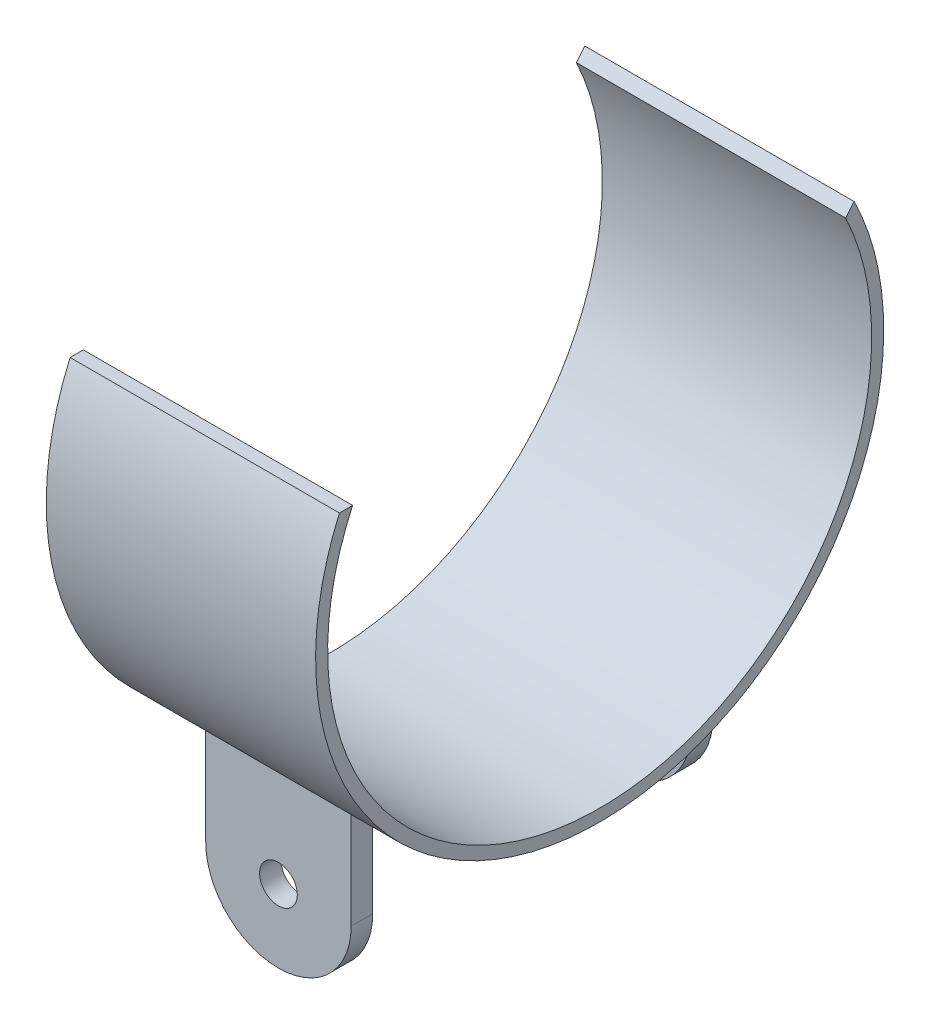
ISO-10303-21;
HEADER;
FILE_DESCRIPTION(('STEP AP214'),'2;1');
FILE_NAME('part.step','',(''),(''),'','','');
FILE_SCHEMA(('AUTOMOTIVE_DESIGN { 1 0 10303 214 1 1 1 1 }'));
ENDSEC;
DATA;
#1=APPLICATION_CONTEXT('core data for automotive mechanical design processes');
#2=APPLICATION_PROTOCOL_DEFINITION('international standard','automotive_design',2000,#1);
#3=PRODUCT_CONTEXT('',#1,'mechanical');
#4=PRODUCT('Part','Part','',(#3));
#5=PRODUCT_RELATED_PRODUCT_CATEGORY('part','',(#4));
#6=PRODUCT_DEFINITION_FORMATION('','',#4);
#7=PRODUCT_DEFINITION_CONTEXT('part definition',#1,'design');
#8=PRODUCT_DEFINITION('design','',#6,#7);
#9=PRODUCT_DEFINITION_SHAPE('','',#8);
#10=(LENGTH_UNIT() NAMED_UNIT(*) SI_UNIT(.MILLI.,.METRE.));
#11=(NAMED_UNIT(*) PLANE_ANGLE_UNIT() SI_UNIT($,.RADIAN.));
#12=(NAMED_UNIT(*) SI_UNIT($,.STERADIAN.) SOLID_ANGLE_UNIT());
#13=UNCERTAINTY_MEASURE_WITH_UNIT(LENGTH_MEASURE(1.E-05),#10,'distance_accuracy_value','');
#14=(GEOMETRIC_REPRESENTATION_CONTEXT(3) GLOBAL_UNCERTAINTY_ASSIGNED_CONTEXT((#13)) GLOBAL_UNIT_ASSIGNED_CONTEXT((#10,
#11,#12)) REPRESENTATION_CONTEXT('',''));
#15=CARTESIAN_POINT('',(0.,0.,0.));
#16=DIRECTION('',(0.,0.,1.));
#17=DIRECTION('',(1.,0.,0.));
#18=AXIS2_PLACEMENT_3D('',#15,#16,#17);
#19=CARTESIAN_POINT('',(0.,14.42923303716,-163.145841721306));
#20=DIRECTION('',(1.,0.,0.));
#21=DIRECTION('',(0.,0.,-1.));
#22=AXIS2_PLACEMENT_3D('',#19,#20,#21);
#23=CYLINDRICAL_SURFACE('',#22,263.670833432094);
#24=DIRECTION('',(1.,0.,0.));
#25=VECTOR('',#24,1.);
#26=CARTESIAN_POINT('',(0.,-200.206876614147,-10.));
#27=LINE('',#26,#25);
#28=CARTESIAN_POINT('',(-67.5,-200.206876614147,-10.));
#29=VERTEX_POINT('',#28);
#30=CARTESIAN_POINT('',(67.5,-200.206876614147,-10.));
#31=VERTEX_POINT('',#30);
#32=EDGE_CURVE('E169',#29,#31,#27,.T.);
#33=ORIENTED_EDGE('',*,*,#32,.F.);
#34=CARTESIAN_POINT('',(-67.5000000000001,14.42923303716,-163.145841721306));
#35=DIRECTION('',(1.,0.,0.));
#36=DIRECTION('',(0.,1.,0.));
#37=AXIS2_PLACEMENT_3D('',#34,#35,#36);
#38=CIRCLE('',#37,263.670833432094);
#39=CARTESIAN_POINT('',(-67.5,-184.424547156719,10.));
#40=VERTEX_POINT('',#39);
#41=EDGE_CURVE('E167',#40,#29,#38,.T.);
#42=ORIENTED_EDGE('',*,*,#41,.F.);
#43=DIRECTION('',(1.,0.,0.));
#44=VECTOR('',#43,1.);
#45=CARTESIAN_POINT('',(0.,-184.424547156719,10.));
#46=LINE('',#45,#44);
#47=CARTESIAN_POINT('',(67.5,-184.424547156719,10.));
#48=VERTEX_POINT('',#47);
#49=EDGE_CURVE('E161',#40,#48,#46,.T.);
#50=ORIENTED_EDGE('',*,*,#49,.T.);
#51=CARTESIAN_POINT('',(67.4999999999999,14.42923303716,-163.145841721306));
#52=DIRECTION('',(-1.,0.,0.));
#53=DIRECTION('',(0.,-1.,0.));
#54=AXIS2_PLACEMENT_3D('',#51,#52,#53);
#55=CIRCLE('',#54,263.670833432094);
#56=EDGE_CURVE('E164',#31,#48,#55,.T.);
#57=ORIENTED_EDGE('',*,*,#56,.F.);
#58=EDGE_LOOP('',(#33,#42,#50,#57));
#59=FACE_BOUND('',#58,.T.);
#60=CARTESIAN_POINT('',(125.,14.42923303716,-163.145841721306));
#61=DIRECTION('',(1.,0.,0.));
#62=DIRECTION('',(0.,0.400706305130195,0.916206558058229));
#63=AXIS2_PLACEMENT_3D('',#60,#61,#62);
#64=CIRCLE('',#63,263.670833432094);
#65=CARTESIAN_POINT('',(125.,120.083798472333,78.4311050378574));
#66=VERTEX_POINT('',#65);
#67=CARTESIAN_POINT('',(125.,131.574465119119,-399.364602625766));
#68=VERTEX_POINT('',#67);
#69=EDGE_CURVE('E156',#66,#68,#64,.T.);
#70=ORIENTED_EDGE('',*,*,#69,.F.);
#71=DIRECTION('',(1.,0.,0.));
#72=VECTOR('',#71,1.);
#73=CARTESIAN_POINT('',(125.,120.083798472333,78.4311050378574));
#74=LINE('',#73,#72);
#75=CARTESIAN_POINT('',(-125.,120.083798472333,78.4311050378574));
#76=VERTEX_POINT('',#75);
#77=EDGE_CURVE('E148',#76,#66,#74,.T.);
#78=ORIENTED_EDGE('',*,*,#77,.F.);
#79=CARTESIAN_POINT('',(-125.,14.42923303716,-163.145841721306));
#80=DIRECTION('',(1.,0.,0.));
#81=DIRECTION('',(0.,0.400706305130195,0.916206558058229));
#82=AXIS2_PLACEMENT_3D('',#79,#80,#81);
#83=CIRCLE('',#82,263.670833432094);
#84=CARTESIAN_POINT('',(-125.,131.574465119119,-399.364602625766));
#85=VERTEX_POINT('',#84);
#86=EDGE_CURVE('E143',#76,#85,#83,.T.);
#87=ORIENTED_EDGE('',*,*,#86,.T.);
#88=DIRECTION('',(1.,0.,0.));
#89=VECTOR('',#88,1.);
#90=CARTESIAN_POINT('',(125.,131.57446511912,-399.364602625766));
#91=LINE('',#90,#89);
#92=EDGE_CURVE('E141',#85,#68,#91,.T.);
#93=ORIENTED_EDGE('',*,*,#92,.T.);
#94=EDGE_LOOP('',(#70,#78,#87,#93));
#95=FACE_BOUND('',#94,.T.);
#96=CARTESIAN_POINT('',(-67.5000000000001,14.42923303716,-163.145841721306));
#97=DIRECTION('',(1.,0.,0.));
#98=DIRECTION('',(0.,1.,0.));
#99=AXIS2_PLACEMENT_3D('',#96,#97,#98);
#100=CIRCLE('',#99,263.670833432094);
#101=CARTESIAN_POINT('',(-67.5,-207.302298874776,-305.825329240573));
#102=VERTEX_POINT('',#101);
#103=CARTESIAN_POINT('',(-67.5,-193.074243423461,-325.825329240573));
#104=VERTEX_POINT('',#103);
#105=EDGE_CURVE('E45',#102,#104,#100,.T.);
#106=ORIENTED_EDGE('',*,*,#105,.F.);
#107=DIRECTION('',(1.,0.,0.));
#108=VECTOR('',#107,1.);
#109=CARTESIAN_POINT('',(0.,-207.302298874776,-305.825329240573));
#110=LINE('',#109,#108);
#111=CARTESIAN_POINT('',(67.5,-207.302298874776,-305.825329240573));
#112=VERTEX_POINT('',#111);
#113=EDGE_CURVE('E176',#112,#102,#110,.F.);
#114=ORIENTED_EDGE('',*,*,#113,.F.);
#115=CARTESIAN_POINT('',(67.4999999999999,14.42923303716,-163.145841721306));
#116=DIRECTION('',(-1.,0.,0.));
#117=DIRECTION('',(0.,-1.,0.));
#118=AXIS2_PLACEMENT_3D('',#115,#116,#117);
#119=CIRCLE('',#118,263.670833432094);
#120=CARTESIAN_POINT('',(67.5,-193.074243423461,-325.825329240573));
#121=VERTEX_POINT('',#120);
#122=EDGE_CURVE('E174',#121,#112,#119,.T.);
#123=ORIENTED_EDGE('',*,*,#122,.F.);
#124=DIRECTION('',(1.,0.,0.));
#125=VECTOR('',#124,1.);
#126=CARTESIAN_POINT('',(0.,-193.074243423461,-325.825329240573));
#127=LINE('',#126,#125);
#128=EDGE_CURVE('E171',#121,#104,#127,.F.);
#129=ORIENTED_EDGE('',*,*,#128,.T.);
#130=EDGE_LOOP('',(#106,#114,#123,#129));
#131=FACE_BOUND('',#130,.T.);
#132=ADVANCED_FACE('F37',(#59,#95,#131),#23,.T.);
#133=CARTESIAN_POINT('',(0.,120.083798472333,0.));
#134=DIRECTION('',(0.,1.,0.));
#135=DIRECTION('',(0.,0.,1.));
#136=AXIS2_PLACEMENT_3D('',#133,#134,#135);
#137=PLANE('',#136);
#138=DIRECTION('',(1.,0.,0.));
#139=VECTOR('',#138,1.);
#140=CARTESIAN_POINT('',(-125.,120.083798472333,66.1865868680776));
#141=LINE('',#140,#139);
#142=CARTESIAN_POINT('',(-125.,120.083798472333,66.1865868680776));
#143=VERTEX_POINT('',#142);
#144=CARTESIAN_POINT('',(125.,120.083798472333,66.1865868680776));
#145=VERTEX_POINT('',#144);
#146=EDGE_CURVE('E52',#143,#145,#141,.T.);
#147=ORIENTED_EDGE('',*,*,#146,.F.);
#148=DIRECTION('',(0.,0.,1.));
#149=VECTOR('',#148,1.);
#150=CARTESIAN_POINT('',(-125.,120.083798472333,78.4311050378574));
#151=LINE('',#150,#149);
#152=EDGE_CURVE('E138',#143,#76,#151,.T.);
#153=ORIENTED_EDGE('',*,*,#152,.T.);
#154=ORIENTED_EDGE('',*,*,#77,.T.);
#155=DIRECTION('',(0.,0.,-1.));
#156=VECTOR('',#155,1.);
#157=CARTESIAN_POINT('',(125.,120.083798472333,78.4311050378574));
#158=LINE('',#157,#156);
#159=EDGE_CURVE('E144',#66,#145,#158,.T.);
#160=ORIENTED_EDGE('',*,*,#159,.T.);
#161=EDGE_LOOP('',(#147,#153,#154,#160));
#162=FACE_BOUND('',#161,.T.);
#163=ADVANCED_FACE('F39',(#162),#137,.T.);
#164=CARTESIAN_POINT('',(0.,71.4927529371882,-348.950060093408));
#165=DIRECTION('',(0.,-0.642787609686544,-0.766044443118975));
#166=DIRECTION('',(0.,0.766044443118975,-0.642787609686544));
#167=AXIS2_PLACEMENT_3D('',#164,#165,#166);
#168=PLANE('',#167);
#169=DIRECTION('',(0.,0.766044443118975,-0.642787609686544));
#170=VECTOR('',#169,1.);
#171=CARTESIAN_POINT('',(-125.,131.57446511912,-399.364602625766));
#172=LINE('',#171,#170);
#173=CARTESIAN_POINT('',(-125.,122.19462001649,-391.49397805965));
#174=VERTEX_POINT('',#173);
#175=EDGE_CURVE('E136',#174,#85,#172,.T.);
#176=ORIENTED_EDGE('',*,*,#175,.F.);
#177=DIRECTION('',(1.,0.,0.));
#178=VECTOR('',#177,1.);
#179=CARTESIAN_POINT('',(-125.,122.19462001649,-391.49397805965));
#180=LINE('',#179,#178);
#181=CARTESIAN_POINT('',(125.,122.19462001649,-391.49397805965));
#182=VERTEX_POINT('',#181);
#183=EDGE_CURVE('E123',#174,#182,#180,.T.);
#184=ORIENTED_EDGE('',*,*,#183,.T.);
#185=DIRECTION('',(0.,-0.766044443118975,0.642787609686544));
#186=VECTOR('',#185,1.);
#187=CARTESIAN_POINT('',(125.,131.57446511912,-399.364602625766));
#188=LINE('',#187,#186);
#189=EDGE_CURVE('E158',#68,#182,#188,.T.);
#190=ORIENTED_EDGE('',*,*,#189,.F.);
#191=ORIENTED_EDGE('',*,*,#92,.F.);
#192=EDGE_LOOP('',(#176,#184,#190,#191));
#193=FACE_BOUND('',#192,.T.);
#194=ADVANCED_FACE('F140',(#193),#168,.F.);
#195=CARTESIAN_POINT('',(-125.,120.083798472333,78.4311050378574));
#196=DIRECTION('',(1.,0.,0.));
#197=DIRECTION('',(0.,0.,-1.));
#198=AXIS2_PLACEMENT_3D('',#195,#196,#197);
#199=PLANE('',#198);
#200=ORIENTED_EDGE('',*,*,#152,.F.);
#201=CARTESIAN_POINT('',(-125.,14.42923303716,-163.145841721306));
#202=DIRECTION('',(1.,0.,0.));
#203=DIRECTION('',(0.,0.,-1.));
#204=AXIS2_PLACEMENT_3D('',#201,#202,#203);
#205=CIRCLE('',#204,252.5);
#206=EDGE_CURVE('E126',#143,#174,#205,.T.);
#207=ORIENTED_EDGE('',*,*,#206,.T.);
#208=ORIENTED_EDGE('',*,*,#175,.T.);
#209=ORIENTED_EDGE('',*,*,#86,.F.);
#210=EDGE_LOOP('',(#200,#207,#208,#209));
#211=FACE_BOUND('',#210,.T.);
#212=ADVANCED_FACE('F134',(#211),#199,.F.);
#213=CARTESIAN_POINT('',(125.,120.083798472333,78.4311050378574));
#214=DIRECTION('',(-1.,0.,0.));
#215=DIRECTION('',(0.,0.,1.));
#216=AXIS2_PLACEMENT_3D('',#213,#214,#215);
#217=PLANE('',#216);
#218=ORIENTED_EDGE('',*,*,#189,.T.);
#219=CARTESIAN_POINT('',(125.,14.42923303716,-163.145841721306));
#220=DIRECTION('',(-1.,0.,0.));
#221=DIRECTION('',(0.,0.,1.));
#222=AXIS2_PLACEMENT_3D('',#219,#220,#221);
#223=CIRCLE('',#222,252.5);
#224=EDGE_CURVE('E11',#182,#145,#223,.T.);
#225=ORIENTED_EDGE('',*,*,#224,.T.);
#226=ORIENTED_EDGE('',*,*,#159,.F.);
#227=ORIENTED_EDGE('',*,*,#69,.T.);
#228=EDGE_LOOP('',(#218,#225,#226,#227));
#229=FACE_BOUND('',#228,.T.);
#230=ADVANCED_FACE('F245',(#229),#217,.F.);
#231=CARTESIAN_POINT('',(0.,-275.,-10.));
#232=DIRECTION('',(0.,0.,1.));
#233=DIRECTION('',(1.,0.,0.));
#234=AXIS2_PLACEMENT_3D('',#231,#232,#233);
#235=PLANE('',#234);
#236=CARTESIAN_POINT('',(0.,-275.,-10.));
#237=DIRECTION('',(0.,0.,1.));
#238=DIRECTION('',(1.,0.,0.));
#239=AXIS2_PLACEMENT_3D('',#236,#237,#238);
#240=CIRCLE('',#239,17.5);
#241=CARTESIAN_POINT('',(17.5000000000001,-275.,-10.));
#242=VERTEX_POINT('',#241);
#243=EDGE_CURVE('E215',#242,#242,#240,.T.);
#244=ORIENTED_EDGE('',*,*,#243,.T.);
#245=EDGE_LOOP('',(#244));
#246=FACE_BOUND('',#245,.T.);
#247=DIRECTION('',(0.,1.,0.));
#248=VECTOR('',#247,1.);
#249=CARTESIAN_POINT('',(-67.4999999999999,-275.,-10.));
#250=LINE('',#249,#248);
#251=CARTESIAN_POINT('',(-67.4999999999999,-275.,-10.));
#252=VERTEX_POINT('',#251);
#253=EDGE_CURVE('E226',#252,#29,#250,.T.);
#254=ORIENTED_EDGE('',*,*,#253,.T.);
#255=ORIENTED_EDGE('',*,*,#32,.T.);
#256=DIRECTION('',(0.,-1.,0.));
#257=VECTOR('',#256,1.);
#258=CARTESIAN_POINT('',(67.5,-175.,-10.));
#259=LINE('',#258,#257);
#260=CARTESIAN_POINT('',(67.5,-275.,-10.));
#261=VERTEX_POINT('',#260);
#262=EDGE_CURVE('E229',#31,#261,#259,.T.);
#263=ORIENTED_EDGE('',*,*,#262,.T.);
#264=CARTESIAN_POINT('',(0.,-275.,-10.));
#265=DIRECTION('',(0.,0.,1.));
#266=DIRECTION('',(1.,0.,0.));
#267=AXIS2_PLACEMENT_3D('',#264,#265,#266);
#268=CIRCLE('',#267,67.5);
#269=EDGE_CURVE('E231',#252,#261,#268,.T.);
#270=ORIENTED_EDGE('',*,*,#269,.F.);
#271=EDGE_LOOP('',(#254,#255,#263,#270));
#272=FACE_BOUND('',#271,.T.);
#273=ADVANCED_FACE('F247',(#246,#272),#235,.F.);
#274=CARTESIAN_POINT('',(0.,-275.,10.));
#275=DIRECTION('',(0.,0.,1.));
#276=DIRECTION('',(1.,0.,0.));
#277=AXIS2_PLACEMENT_3D('',#274,#275,#276);
#278=PLANE('',#277);
#279=CARTESIAN_POINT('',(0.,-275.,10.));
#280=DIRECTION('',(0.,0.,1.));
#281=DIRECTION('',(1.,0.,0.));
#282=AXIS2_PLACEMENT_3D('',#279,#280,#281);
#283=CIRCLE('',#282,17.5);
#284=CARTESIAN_POINT('',(17.5000000000001,-275.,10.));
#285=VERTEX_POINT('',#284);
#286=EDGE_CURVE('E212',#285,#285,#283,.T.);
#287=ORIENTED_EDGE('',*,*,#286,.F.);
#288=EDGE_LOOP('',(#287));
#289=FACE_BOUND('',#288,.T.);
#290=ORIENTED_EDGE('',*,*,#49,.F.);
#291=DIRECTION('',(0.,1.,0.));
#292=VECTOR('',#291,1.);
#293=CARTESIAN_POINT('',(-67.4999999999999,-275.,10.));
#294=LINE('',#293,#292);
#295=CARTESIAN_POINT('',(-67.4999999999999,-275.,10.));
#296=VERTEX_POINT('',#295);
#297=EDGE_CURVE('E218',#296,#40,#294,.T.);
#298=ORIENTED_EDGE('',*,*,#297,.F.);
#299=CARTESIAN_POINT('',(0.,-275.,10.));
#300=DIRECTION('',(0.,0.,1.));
#301=DIRECTION('',(1.,0.,0.));
#302=AXIS2_PLACEMENT_3D('',#299,#300,#301);
#303=CIRCLE('',#302,67.5);
#304=CARTESIAN_POINT('',(67.5,-275.,10.));
#305=VERTEX_POINT('',#304);
#306=EDGE_CURVE('E223',#296,#305,#303,.T.);
#307=ORIENTED_EDGE('',*,*,#306,.T.);
#308=DIRECTION('',(0.,-1.,0.));
#309=VECTOR('',#308,1.);
#310=CARTESIAN_POINT('',(67.5,-175.,10.));
#311=LINE('',#310,#309);
#312=EDGE_CURVE('E221',#48,#305,#311,.T.);
#313=ORIENTED_EDGE('',*,*,#312,.F.);
#314=EDGE_LOOP('',(#290,#298,#307,#313));
#315=FACE_BOUND('',#314,.T.);
#316=ADVANCED_FACE('F253',(#289,#315),#278,.T.);
#317=CARTESIAN_POINT('',(-67.4999999999999,-275.,-10.));
#318=DIRECTION('',(1.,0.,0.));
#319=DIRECTION('',(0.,1.,0.));
#320=AXIS2_PLACEMENT_3D('',#317,#318,#319);
#321=PLANE('',#320);
#322=ORIENTED_EDGE('',*,*,#297,.T.);
#323=ORIENTED_EDGE('',*,*,#41,.T.);
#324=ORIENTED_EDGE('',*,*,#253,.F.);
#325=DIRECTION('',(0.,0.,1.));
#326=VECTOR('',#325,1.);
#327=CARTESIAN_POINT('',(-67.4999999999999,-275.,-10.));
#328=LINE('',#327,#326);
#329=EDGE_CURVE('E234',#252,#296,#328,.T.);
#330=ORIENTED_EDGE('',*,*,#329,.T.);
#331=EDGE_LOOP('',(#322,#323,#324,#330));
#332=FACE_BOUND('',#331,.T.);
#333=ADVANCED_FACE('F265',(#332),#321,.F.);
#334=CARTESIAN_POINT('',(67.5,-175.,-10.));
#335=DIRECTION('',(-1.,0.,0.));
#336=DIRECTION('',(0.,-1.,0.));
#337=AXIS2_PLACEMENT_3D('',#334,#335,#336);
#338=PLANE('',#337);
#339=ORIENTED_EDGE('',*,*,#262,.F.);
#340=ORIENTED_EDGE('',*,*,#56,.T.);
#341=ORIENTED_EDGE('',*,*,#312,.T.);
#342=DIRECTION('',(0.,0.,1.));
#343=VECTOR('',#342,1.);
#344=CARTESIAN_POINT('',(67.5,-275.,-10.));
#345=LINE('',#344,#343);
#346=EDGE_CURVE('E235',#261,#305,#345,.T.);
#347=ORIENTED_EDGE('',*,*,#346,.F.);
#348=EDGE_LOOP('',(#339,#340,#341,#347));
#349=FACE_BOUND('',#348,.T.);
#350=ADVANCED_FACE('F268',(#349),#338,.F.);
#351=CARTESIAN_POINT('',(0.,-275.,-10.));
#352=DIRECTION('',(0.,0.,1.));
#353=DIRECTION('',(1.,0.,0.));
#354=AXIS2_PLACEMENT_3D('',#351,#352,#353);
#355=CYLINDRICAL_SURFACE('',#354,67.5);
#356=ORIENTED_EDGE('',*,*,#346,.T.);
#357=ORIENTED_EDGE('',*,*,#306,.F.);
#358=ORIENTED_EDGE('',*,*,#329,.F.);
#359=ORIENTED_EDGE('',*,*,#269,.T.);
#360=EDGE_LOOP('',(#356,#357,#358,#359));
#361=FACE_BOUND('',#360,.T.);
#362=ADVANCED_FACE('F272',(#361),#355,.T.);
#363=CARTESIAN_POINT('',(0.,-275.,-426.816675153399));
#364=DIRECTION('',(0.,0.,1.));
#365=DIRECTION('',(1.,0.,0.));
#366=AXIS2_PLACEMENT_3D('',#363,#364,#365);
#367=CYLINDRICAL_SURFACE('',#366,17.5);
#368=ORIENTED_EDGE('',*,*,#286,.T.);
#369=EDGE_LOOP('',(#368));
#370=FACE_BOUND('',#369,.T.);
#371=ORIENTED_EDGE('',*,*,#243,.F.);
#372=EDGE_LOOP('',(#371));
#373=FACE_BOUND('',#372,.T.);
#374=ADVANCED_FACE('F275',(#370,#373),#367,.F.);
#375=CARTESIAN_POINT('',(0.,-275.,-305.825329240573));
#376=DIRECTION('',(0.,0.,-1.));
#377=DIRECTION('',(1.,0.,0.));
#378=AXIS2_PLACEMENT_3D('',#375,#376,#377);
#379=PLANE('',#378);
#380=CARTESIAN_POINT('',(0.,-275.,-305.825329240573));
#381=DIRECTION('',(0.,0.,1.));
#382=DIRECTION('',(1.,0.,0.));
#383=AXIS2_PLACEMENT_3D('',#380,#381,#382);
#384=CIRCLE('',#383,17.5);
#385=CARTESIAN_POINT('',(17.5000000000001,-275.,-305.825329240573));
#386=VERTEX_POINT('',#385);
#387=EDGE_CURVE('E414',#386,#386,#384,.T.);
#388=ORIENTED_EDGE('',*,*,#387,.F.);
#389=EDGE_LOOP('',(#388));
#390=FACE_BOUND('',#389,.T.);
#391=DIRECTION('',(0.,-1.,0.));
#392=VECTOR('',#391,1.);
#393=CARTESIAN_POINT('',(67.5,-175.,-305.825329240573));
#394=LINE('',#393,#392);
#395=CARTESIAN_POINT('',(67.5,-275.,-305.825329240573));
#396=VERTEX_POINT('',#395);
#397=EDGE_CURVE('E209',#112,#396,#394,.T.);
#398=ORIENTED_EDGE('',*,*,#397,.F.);
#399=ORIENTED_EDGE('',*,*,#113,.T.);
#400=DIRECTION('',(0.,1.,0.));
#401=VECTOR('',#400,1.);
#402=CARTESIAN_POINT('',(-67.4999999999999,-275.,-305.825329240573));
#403=LINE('',#402,#401);
#404=CARTESIAN_POINT('',(-67.4999999999999,-275.,-305.825329240573));
#405=VERTEX_POINT('',#404);
#406=EDGE_CURVE('E183',#405,#102,#403,.T.);
#407=ORIENTED_EDGE('',*,*,#406,.F.);
#408=CARTESIAN_POINT('',(0.,-275.,-305.825329240573));
#409=DIRECTION('',(0.,0.,1.));
#410=DIRECTION('',(1.,0.,0.));
#411=AXIS2_PLACEMENT_3D('',#408,#409,#410);
#412=CIRCLE('',#411,67.5);
#413=EDGE_CURVE('E206',#405,#396,#412,.T.);
#414=ORIENTED_EDGE('',*,*,#413,.T.);
#415=EDGE_LOOP('',(#398,#399,#407,#414));
#416=FACE_BOUND('',#415,.T.);
#417=ADVANCED_FACE('F282',(#390,#416),#379,.F.);
#418=CARTESIAN_POINT('',(0.,-275.,-325.825329240573));
#419=DIRECTION('',(0.,0.,-1.));
#420=DIRECTION('',(1.,0.,0.));
#421=AXIS2_PLACEMENT_3D('',#418,#419,#420);
#422=PLANE('',#421);
#423=CARTESIAN_POINT('',(0.,-275.,-325.825329240573));
#424=DIRECTION('',(0.,0.,1.));
#425=DIRECTION('',(1.,0.,0.));
#426=AXIS2_PLACEMENT_3D('',#423,#424,#425);
#427=CIRCLE('',#426,17.5);
#428=CARTESIAN_POINT('',(17.5000000000001,-275.,-325.825329240573));
#429=VERTEX_POINT('',#428);
#430=EDGE_CURVE('E411',#429,#429,#427,.T.);
#431=ORIENTED_EDGE('',*,*,#430,.T.);
#432=EDGE_LOOP('',(#431));
#433=FACE_BOUND('',#432,.T.);
#434=ORIENTED_EDGE('',*,*,#128,.F.);
#435=DIRECTION('',(0.,-1.,0.));
#436=VECTOR('',#435,1.);
#437=CARTESIAN_POINT('',(67.5,-175.,-325.825329240573));
#438=LINE('',#437,#436);
#439=CARTESIAN_POINT('',(67.5,-275.,-325.825329240573));
#440=VERTEX_POINT('',#439);
#441=EDGE_CURVE('E189',#121,#440,#438,.T.);
#442=ORIENTED_EDGE('',*,*,#441,.T.);
#443=CARTESIAN_POINT('',(0.,-275.,-325.825329240573));
#444=DIRECTION('',(0.,0.,1.));
#445=DIRECTION('',(1.,0.,0.));
#446=AXIS2_PLACEMENT_3D('',#443,#444,#445);
#447=CIRCLE('',#446,67.5);
#448=CARTESIAN_POINT('',(-67.4999999999999,-275.,-325.825329240573));
#449=VERTEX_POINT('',#448);
#450=EDGE_CURVE('E197',#449,#440,#447,.T.);
#451=ORIENTED_EDGE('',*,*,#450,.F.);
#452=DIRECTION('',(0.,1.,0.));
#453=VECTOR('',#452,1.);
#454=CARTESIAN_POINT('',(-67.4999999999999,-275.,-325.825329240573));
#455=LINE('',#454,#453);
#456=EDGE_CURVE('E59',#449,#104,#455,.T.);
#457=ORIENTED_EDGE('',*,*,#456,.T.);
#458=EDGE_LOOP('',(#434,#442,#451,#457));
#459=FACE_BOUND('',#458,.T.);
#460=ADVANCED_FACE('F188',(#433,#459),#422,.T.);
#461=CARTESIAN_POINT('',(-67.4999999999999,-275.,-305.825329240573));
#462=DIRECTION('',(1.,0.,0.));
#463=DIRECTION('',(0.,1.,0.));
#464=AXIS2_PLACEMENT_3D('',#461,#462,#463);
#465=PLANE('',#464);
#466=ORIENTED_EDGE('',*,*,#406,.T.);
#467=ORIENTED_EDGE('',*,*,#105,.T.);
#468=ORIENTED_EDGE('',*,*,#456,.F.);
#469=DIRECTION('',(0.,0.,-1.));
#470=VECTOR('',#469,1.);
#471=CARTESIAN_POINT('',(-67.4999999999999,-275.,-305.825329240573));
#472=LINE('',#471,#470);
#473=EDGE_CURVE('E199',#405,#449,#472,.T.);
#474=ORIENTED_EDGE('',*,*,#473,.F.);
#475=EDGE_LOOP('',(#466,#467,#468,#474));
#476=FACE_BOUND('',#475,.T.);
#477=ADVANCED_FACE('F180',(#476),#465,.F.);
#478=CARTESIAN_POINT('',(67.5,-175.,-305.825329240573));
#479=DIRECTION('',(-1.,0.,0.));
#480=DIRECTION('',(0.,-1.,0.));
#481=AXIS2_PLACEMENT_3D('',#478,#479,#480);
#482=PLANE('',#481);
#483=ORIENTED_EDGE('',*,*,#441,.F.);
#484=ORIENTED_EDGE('',*,*,#122,.T.);
#485=ORIENTED_EDGE('',*,*,#397,.T.);
#486=DIRECTION('',(0.,0.,-1.));
#487=VECTOR('',#486,1.);
#488=CARTESIAN_POINT('',(67.5,-275.,-305.825329240573));
#489=LINE('',#488,#487);
#490=EDGE_CURVE('E196',#396,#440,#489,.T.);
#491=ORIENTED_EDGE('',*,*,#490,.T.);
#492=EDGE_LOOP('',(#483,#484,#485,#491));
#493=FACE_BOUND('',#492,.T.);
#494=ADVANCED_FACE('F193',(#493),#482,.F.);
#495=CARTESIAN_POINT('',(0.,-275.,-305.825329240573));
#496=DIRECTION('',(0.,0.,-1.));
#497=DIRECTION('',(1.,0.,0.));
#498=AXIS2_PLACEMENT_3D('',#495,#496,#497);
#499=CYLINDRICAL_SURFACE('',#498,67.5);
#500=ORIENTED_EDGE('',*,*,#490,.F.);
#501=ORIENTED_EDGE('',*,*,#413,.F.);
#502=ORIENTED_EDGE('',*,*,#473,.T.);
#503=ORIENTED_EDGE('',*,*,#450,.T.);
#504=EDGE_LOOP('',(#500,#501,#502,#503));
#505=FACE_BOUND('',#504,.T.);
#506=ADVANCED_FACE('F291',(#505),#499,.T.);
#507=CARTESIAN_POINT('',(0.,-275.,110.991345912826));
#508=DIRECTION('',(0.,0.,-1.));
#509=DIRECTION('',(1.,0.,0.));
#510=AXIS2_PLACEMENT_3D('',#507,#508,#509);
#511=CYLINDRICAL_SURFACE('',#510,17.5);
#512=ORIENTED_EDGE('',*,*,#430,.F.);
#513=EDGE_LOOP('',(#512));
#514=FACE_BOUND('',#513,.T.);
#515=ORIENTED_EDGE('',*,*,#387,.T.);
#516=EDGE_LOOP('',(#515));
#517=FACE_BOUND('',#516,.T.);
#518=ADVANCED_FACE('F294',(#514,#517),#511,.F.);
#519=CARTESIAN_POINT('',(-125.,14.42923303716,-163.145841721306));
#520=DIRECTION('',(1.,0.,0.));
#521=DIRECTION('',(0.,0.,-1.));
#522=AXIS2_PLACEMENT_3D('',#519,#520,#521);
#523=CYLINDRICAL_SURFACE('',#522,252.5);
#524=ORIENTED_EDGE('',*,*,#146,.T.);
#525=ORIENTED_EDGE('',*,*,#224,.F.);
#526=ORIENTED_EDGE('',*,*,#183,.F.);
#527=ORIENTED_EDGE('',*,*,#206,.F.);
#528=EDGE_LOOP('',(#524,#525,#526,#527));
#529=FACE_BOUND('',#528,.T.);
#530=ADVANCED_FACE('F125',(#529),#523,.F.);
#531=CLOSED_SHELL('',(#132,#163,#194,#212,#230,#273,#316,#333,#350,#362,#374,#417,#460,#477,
#494,#506,#518,#530));
#532=MANIFOLD_SOLID_BREP('B2',#531);
#533=ADVANCED_BREP_SHAPE_REPRESENTATION('',(#18,#532),#14);
#534=SHAPE_DEFINITION_REPRESENTATION(#9,#533);
ENDSEC;
END-ISO-10303-21;
